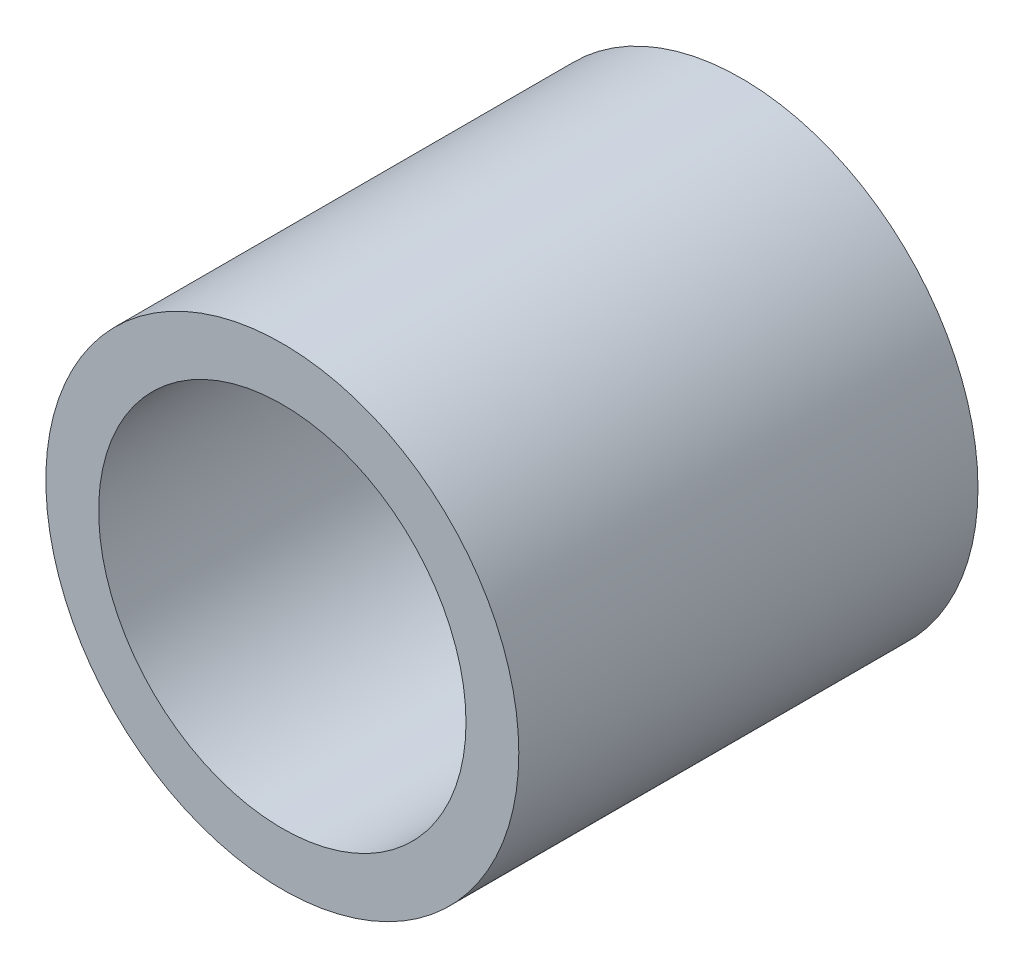
ISO-10303-21;
HEADER;
FILE_DESCRIPTION(('STEP AP214'),'2;1');
FILE_NAME('part.step','',(''),(''),'','','');
FILE_SCHEMA(('AUTOMOTIVE_DESIGN { 1 0 10303 214 1 1 1 1 }'));
ENDSEC;
DATA;
#1=APPLICATION_CONTEXT('core data for automotive mechanical design processes');
#2=APPLICATION_PROTOCOL_DEFINITION('international standard','automotive_design',2000,#1);
#3=PRODUCT_CONTEXT('',#1,'mechanical');
#4=PRODUCT('Part','Part','',(#3));
#5=PRODUCT_RELATED_PRODUCT_CATEGORY('part','',(#4));
#6=PRODUCT_DEFINITION_FORMATION('','',#4);
#7=PRODUCT_DEFINITION_CONTEXT('part definition',#1,'design');
#8=PRODUCT_DEFINITION('design','',#6,#7);
#9=PRODUCT_DEFINITION_SHAPE('','',#8);
#10=(LENGTH_UNIT() NAMED_UNIT(*) SI_UNIT(.MILLI.,.METRE.));
#11=(NAMED_UNIT(*) PLANE_ANGLE_UNIT() SI_UNIT($,.RADIAN.));
#12=(NAMED_UNIT(*) SI_UNIT($,.STERADIAN.) SOLID_ANGLE_UNIT());
#13=UNCERTAINTY_MEASURE_WITH_UNIT(LENGTH_MEASURE(1.E-05),#10,'distance_accuracy_value','');
#14=(GEOMETRIC_REPRESENTATION_CONTEXT(3) GLOBAL_UNCERTAINTY_ASSIGNED_CONTEXT((#13)) GLOBAL_UNIT_ASSIGNED_CONTEXT((#10,
#11,#12)) REPRESENTATION_CONTEXT('',''));
#15=CARTESIAN_POINT('',(0.,0.,0.));
#16=DIRECTION('',(0.,0.,1.));
#17=DIRECTION('',(1.,0.,0.));
#18=AXIS2_PLACEMENT_3D('',#15,#16,#17);
#19=CARTESIAN_POINT('',(0.,0.,5.));
#20=DIRECTION('',(0.,0.,1.));
#21=DIRECTION('',(1.,0.,0.));
#22=AXIS2_PLACEMENT_3D('',#19,#20,#21);
#23=PLANE('',#22);
#24=CARTESIAN_POINT('',(0.,0.,5.));
#25=DIRECTION('',(0.,0.,1.));
#26=DIRECTION('',(1.,0.,0.));
#27=AXIS2_PLACEMENT_3D('',#24,#25,#26);
#28=CIRCLE('',#27,5.15);
#29=CARTESIAN_POINT('',(5.15,0.,5.));
#30=VERTEX_POINT('',#29);
#31=EDGE_CURVE('E10',#30,#30,#28,.T.);
#32=ORIENTED_EDGE('',*,*,#31,.T.);
#33=EDGE_LOOP('',(#32));
#34=FACE_BOUND('',#33,.T.);
#35=CARTESIAN_POINT('',(0.,0.,5.));
#36=DIRECTION('',(0.,0.,1.));
#37=DIRECTION('',(1.,0.,0.));
#38=AXIS2_PLACEMENT_3D('',#35,#36,#37);
#39=CIRCLE('',#38,4.);
#40=CARTESIAN_POINT('',(4.,0.,5.));
#41=VERTEX_POINT('',#40);
#42=EDGE_CURVE('E45',#41,#41,#39,.T.);
#43=ORIENTED_EDGE('',*,*,#42,.F.);
#44=EDGE_LOOP('',(#43));
#45=FACE_BOUND('',#44,.T.);
#46=ADVANCED_FACE('F34',(#34,#45),#23,.T.);
#47=CARTESIAN_POINT('',(0.,0.,-5.));
#48=DIRECTION('',(0.,0.,1.));
#49=DIRECTION('',(1.,0.,0.));
#50=AXIS2_PLACEMENT_3D('',#47,#48,#49);
#51=PLANE('',#50);
#52=CARTESIAN_POINT('',(0.,0.,-5.));
#53=DIRECTION('',(0.,0.,1.));
#54=DIRECTION('',(1.,0.,0.));
#55=AXIS2_PLACEMENT_3D('',#52,#53,#54);
#56=CIRCLE('',#55,5.15);
#57=CARTESIAN_POINT('',(5.15,0.,-5.));
#58=VERTEX_POINT('',#57);
#59=EDGE_CURVE('E38',#58,#58,#56,.T.);
#60=ORIENTED_EDGE('',*,*,#59,.F.);
#61=EDGE_LOOP('',(#60));
#62=FACE_BOUND('',#61,.T.);
#63=CARTESIAN_POINT('',(0.,0.,-5.));
#64=DIRECTION('',(0.,0.,1.));
#65=DIRECTION('',(1.,0.,0.));
#66=AXIS2_PLACEMENT_3D('',#63,#64,#65);
#67=CIRCLE('',#66,4.);
#68=CARTESIAN_POINT('',(4.,0.,-5.));
#69=VERTEX_POINT('',#68);
#70=EDGE_CURVE('E47',#69,#69,#67,.T.);
#71=ORIENTED_EDGE('',*,*,#70,.T.);
#72=EDGE_LOOP('',(#71));
#73=FACE_BOUND('',#72,.T.);
#74=ADVANCED_FACE('F57',(#62,#73),#51,.F.);
#75=CARTESIAN_POINT('',(0.,0.,5.));
#76=DIRECTION('',(0.,0.,-1.));
#77=DIRECTION('',(-1.,0.,0.));
#78=AXIS2_PLACEMENT_3D('',#75,#76,#77);
#79=CYLINDRICAL_SURFACE('',#78,5.15);
#80=ORIENTED_EDGE('',*,*,#31,.F.);
#81=EDGE_LOOP('',(#80));
#82=FACE_BOUND('',#81,.T.);
#83=ORIENTED_EDGE('',*,*,#59,.T.);
#84=EDGE_LOOP('',(#83));
#85=FACE_BOUND('',#84,.T.);
#86=ADVANCED_FACE('F36',(#82,#85),#79,.T.);
#87=CARTESIAN_POINT('',(0.,0.,5.));
#88=DIRECTION('',(0.,0.,-1.));
#89=DIRECTION('',(-1.,0.,0.));
#90=AXIS2_PLACEMENT_3D('',#87,#88,#89);
#91=CYLINDRICAL_SURFACE('',#90,4.);
#92=ORIENTED_EDGE('',*,*,#42,.T.);
#93=EDGE_LOOP('',(#92));
#94=FACE_BOUND('',#93,.T.);
#95=ORIENTED_EDGE('',*,*,#70,.F.);
#96=EDGE_LOOP('',(#95));
#97=FACE_BOUND('',#96,.T.);
#98=ADVANCED_FACE('F53',(#94,#97),#91,.F.);
#99=CLOSED_SHELL('',(#46,#74,#86,#98));
#100=MANIFOLD_SOLID_BREP('B2',#99);
#101=ADVANCED_BREP_SHAPE_REPRESENTATION('',(#18,#100),#14);
#102=SHAPE_DEFINITION_REPRESENTATION(#9,#101);
ENDSEC;
END-ISO-10303-21;
